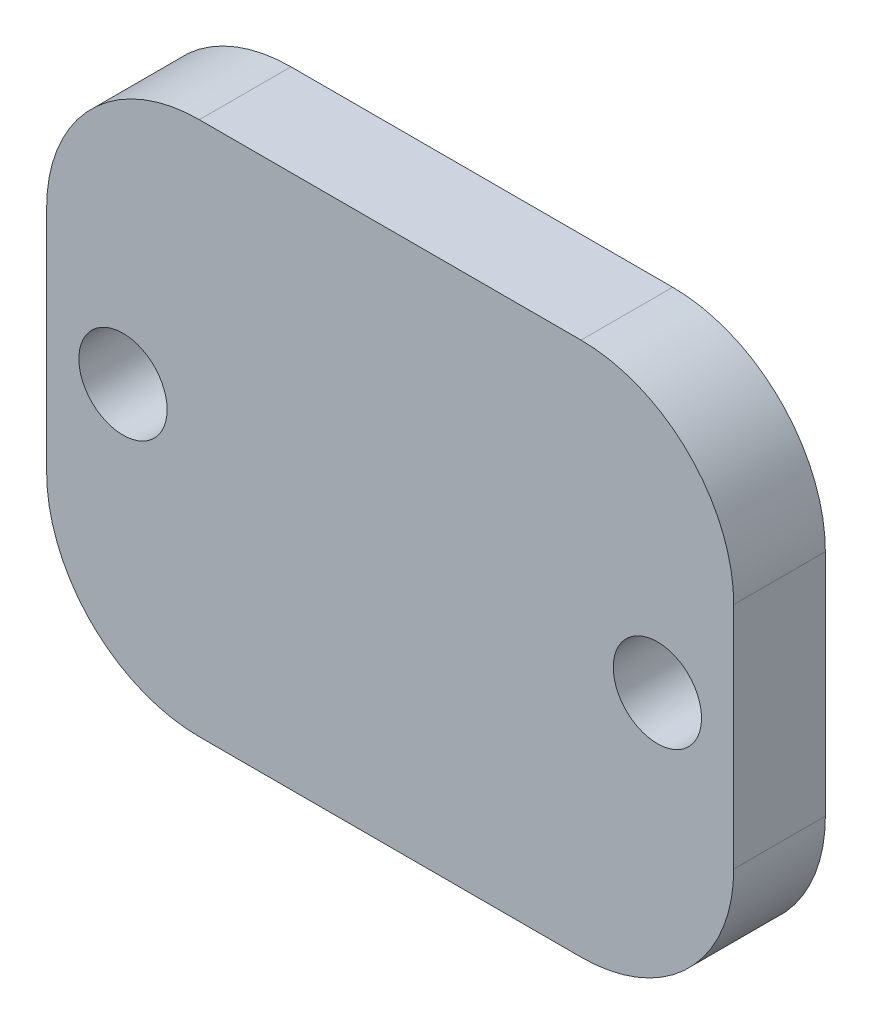
ISO-10303-21;
HEADER;
FILE_DESCRIPTION(('STEP AP214'),'2;1');
FILE_NAME('part.step','',(''),(''),'','','');
FILE_SCHEMA(('AUTOMOTIVE_DESIGN { 1 0 10303 214 1 1 1 1 }'));
ENDSEC;
DATA;
#1=APPLICATION_CONTEXT('core data for automotive mechanical design processes');
#2=APPLICATION_PROTOCOL_DEFINITION('international standard','automotive_design',2000,#1);
#3=PRODUCT_CONTEXT('',#1,'mechanical');
#4=PRODUCT('Part','Part','',(#3));
#5=PRODUCT_RELATED_PRODUCT_CATEGORY('part','',(#4));
#6=PRODUCT_DEFINITION_FORMATION('','',#4);
#7=PRODUCT_DEFINITION_CONTEXT('part definition',#1,'design');
#8=PRODUCT_DEFINITION('design','',#6,#7);
#9=PRODUCT_DEFINITION_SHAPE('','',#8);
#10=(LENGTH_UNIT() NAMED_UNIT(*) SI_UNIT(.MILLI.,.METRE.));
#11=(NAMED_UNIT(*) PLANE_ANGLE_UNIT() SI_UNIT($,.RADIAN.));
#12=(NAMED_UNIT(*) SI_UNIT($,.STERADIAN.) SOLID_ANGLE_UNIT());
#13=UNCERTAINTY_MEASURE_WITH_UNIT(LENGTH_MEASURE(1.E-05),#10,'distance_accuracy_value','');
#14=(GEOMETRIC_REPRESENTATION_CONTEXT(3) GLOBAL_UNCERTAINTY_ASSIGNED_CONTEXT((#13)) GLOBAL_UNIT_ASSIGNED_CONTEXT((#10,
#11,#12)) REPRESENTATION_CONTEXT('',''));
#15=CARTESIAN_POINT('',(0.,0.,0.));
#16=DIRECTION('',(0.,0.,1.));
#17=DIRECTION('',(1.,0.,0.));
#18=AXIS2_PLACEMENT_3D('',#15,#16,#17);
#19=CARTESIAN_POINT('',(-109.400976219246,18.7017218028714,6.));
#20=DIRECTION('',(0.,0.,-1.));
#21=DIRECTION('',(-1.,0.,0.));
#22=AXIS2_PLACEMENT_3D('',#19,#20,#21);
#23=PLANE('',#22);
#24=CARTESIAN_POINT('',(-109.400976219246,18.7017218028714,6.));
#25=DIRECTION('',(0.,0.,1.));
#26=DIRECTION('',(-1.,0.,0.));
#27=AXIS2_PLACEMENT_3D('',#24,#25,#26);
#28=CIRCLE('',#27,10.);
#29=CARTESIAN_POINT('',(-109.400976219246,8.70172180287143,6.));
#30=VERTEX_POINT('',#29);
#31=CARTESIAN_POINT('',(-99.4009762192463,18.7017218028715,6.));
#32=VERTEX_POINT('',#31);
#33=EDGE_CURVE('E170',#30,#32,#28,.T.);
#34=ORIENTED_EDGE('',*,*,#33,.T.);
#35=DIRECTION('',(0.,1.,0.));
#36=VECTOR('',#35,1.);
#37=CARTESIAN_POINT('',(-99.4009762192463,33.7017218028714,6.));
#38=LINE('',#37,#36);
#39=CARTESIAN_POINT('',(-99.4009762192463,33.7017218028714,6.));
#40=VERTEX_POINT('',#39);
#41=EDGE_CURVE('E106',#32,#40,#38,.T.);
#42=ORIENTED_EDGE('',*,*,#41,.T.);
#43=CARTESIAN_POINT('',(-109.400976219246,33.7017218028714,6.));
#44=DIRECTION('',(0.,0.,1.));
#45=DIRECTION('',(-1.,0.,0.));
#46=AXIS2_PLACEMENT_3D('',#43,#44,#45);
#47=CIRCLE('',#46,10.);
#48=CARTESIAN_POINT('',(-109.400976219246,43.7017218028714,6.));
#49=VERTEX_POINT('',#48);
#50=EDGE_CURVE('E191',#40,#49,#47,.T.);
#51=ORIENTED_EDGE('',*,*,#50,.T.);
#52=DIRECTION('',(-1.,0.,0.));
#53=VECTOR('',#52,1.);
#54=CARTESIAN_POINT('',(-134.400976219246,43.7017218028714,6.));
#55=LINE('',#54,#53);
#56=CARTESIAN_POINT('',(-134.400976219246,43.7017218028714,6.));
#57=VERTEX_POINT('',#56);
#58=EDGE_CURVE('E205',#49,#57,#55,.T.);
#59=ORIENTED_EDGE('',*,*,#58,.T.);
#60=CARTESIAN_POINT('',(-134.400976219246,33.7017218028714,6.));
#61=DIRECTION('',(0.,0.,1.));
#62=DIRECTION('',(1.,0.,0.));
#63=AXIS2_PLACEMENT_3D('',#60,#61,#62);
#64=CIRCLE('',#63,10.);
#65=CARTESIAN_POINT('',(-144.400976219246,33.7017218028714,6.));
#66=VERTEX_POINT('',#65);
#67=EDGE_CURVE('E125',#57,#66,#64,.T.);
#68=ORIENTED_EDGE('',*,*,#67,.T.);
#69=DIRECTION('',(0.,-1.,0.));
#70=VECTOR('',#69,1.);
#71=CARTESIAN_POINT('',(-144.400976219246,33.7017218028714,6.));
#72=LINE('',#71,#70);
#73=CARTESIAN_POINT('',(-144.400976219246,18.7017218028715,6.));
#74=VERTEX_POINT('',#73);
#75=EDGE_CURVE('E119',#66,#74,#72,.T.);
#76=ORIENTED_EDGE('',*,*,#75,.T.);
#77=CARTESIAN_POINT('',(-134.400976219246,18.7017218028714,6.));
#78=DIRECTION('',(0.,0.,1.));
#79=DIRECTION('',(-1.,0.,0.));
#80=AXIS2_PLACEMENT_3D('',#77,#78,#79);
#81=CIRCLE('',#80,10.);
#82=CARTESIAN_POINT('',(-134.400976219246,8.70172180287142,6.));
#83=VERTEX_POINT('',#82);
#84=EDGE_CURVE('E123',#74,#83,#81,.T.);
#85=ORIENTED_EDGE('',*,*,#84,.T.);
#86=DIRECTION('',(1.,0.,0.));
#87=VECTOR('',#86,1.);
#88=CARTESIAN_POINT('',(-134.400976219246,8.70172180287143,6.));
#89=LINE('',#88,#87);
#90=EDGE_CURVE('E63',#83,#30,#89,.T.);
#91=ORIENTED_EDGE('',*,*,#90,.T.);
#92=EDGE_LOOP('',(#34,#42,#51,#59,#68,#76,#85,#91));
#93=FACE_BOUND('',#92,.T.);
#94=CARTESIAN_POINT('',(-139.400925622596,26.2017218028714,6.));
#95=DIRECTION('',(0.,0.,1.));
#96=DIRECTION('',(1.,0.,0.));
#97=AXIS2_PLACEMENT_3D('',#94,#95,#96);
#98=CIRCLE('',#97,2.89000000000002);
#99=CARTESIAN_POINT('',(-136.510925622596,26.2017218028714,6.));
#100=VERTEX_POINT('',#99);
#101=EDGE_CURVE('E152',#100,#100,#98,.T.);
#102=ORIENTED_EDGE('',*,*,#101,.F.);
#103=EDGE_LOOP('',(#102));
#104=FACE_BOUND('',#103,.T.);
#105=CARTESIAN_POINT('',(-104.401026815897,26.2017218028714,6.));
#106=DIRECTION('',(0.,0.,1.));
#107=DIRECTION('',(-1.,0.,0.));
#108=AXIS2_PLACEMENT_3D('',#105,#106,#107);
#109=CIRCLE('',#108,2.89000000000002);
#110=CARTESIAN_POINT('',(-107.291026815897,26.2017218028714,6.));
#111=VERTEX_POINT('',#110);
#112=EDGE_CURVE('E219',#111,#111,#109,.T.);
#113=ORIENTED_EDGE('',*,*,#112,.F.);
#114=EDGE_LOOP('',(#113));
#115=FACE_BOUND('',#114,.T.);
#116=ADVANCED_FACE('F45',(#93,#104,#115),#23,.F.);
#117=CARTESIAN_POINT('',(-109.400976219246,18.7017218028714,0.));
#118=DIRECTION('',(0.,0.,-1.));
#119=DIRECTION('',(-1.,0.,0.));
#120=AXIS2_PLACEMENT_3D('',#117,#118,#119);
#121=PLANE('',#120);
#122=CARTESIAN_POINT('',(-139.400925622596,26.2017218028714,0.));
#123=DIRECTION('',(0.,0.,1.));
#124=DIRECTION('',(1.,0.,0.));
#125=AXIS2_PLACEMENT_3D('',#122,#123,#124);
#126=CIRCLE('',#125,2.89000000000002);
#127=CARTESIAN_POINT('',(-136.510925622596,26.2017218028714,0.));
#128=VERTEX_POINT('',#127);
#129=EDGE_CURVE('E215',#128,#128,#126,.T.);
#130=ORIENTED_EDGE('',*,*,#129,.T.);
#131=EDGE_LOOP('',(#130));
#132=FACE_BOUND('',#131,.T.);
#133=CARTESIAN_POINT('',(-109.400976219246,18.7017218028714,0.));
#134=DIRECTION('',(0.,0.,1.));
#135=DIRECTION('',(-1.,0.,0.));
#136=AXIS2_PLACEMENT_3D('',#133,#134,#135);
#137=CIRCLE('',#136,10.);
#138=CARTESIAN_POINT('',(-109.400976219246,8.70172180287143,0.));
#139=VERTEX_POINT('',#138);
#140=CARTESIAN_POINT('',(-99.4009762192463,18.7017218028715,0.));
#141=VERTEX_POINT('',#140);
#142=EDGE_CURVE('E147',#139,#141,#137,.T.);
#143=ORIENTED_EDGE('',*,*,#142,.F.);
#144=DIRECTION('',(1.,0.,0.));
#145=VECTOR('',#144,1.);
#146=CARTESIAN_POINT('',(-134.400976219246,8.70172180287143,0.));
#147=LINE('',#146,#145);
#148=CARTESIAN_POINT('',(-134.400976219246,8.70172180287142,0.));
#149=VERTEX_POINT('',#148);
#150=EDGE_CURVE('E98',#149,#139,#147,.T.);
#151=ORIENTED_EDGE('',*,*,#150,.F.);
#152=CARTESIAN_POINT('',(-134.400976219246,18.7017218028714,0.));
#153=DIRECTION('',(0.,0.,1.));
#154=DIRECTION('',(-1.,0.,0.));
#155=AXIS2_PLACEMENT_3D('',#152,#153,#154);
#156=CIRCLE('',#155,10.);
#157=CARTESIAN_POINT('',(-144.400976219246,18.7017218028715,0.));
#158=VERTEX_POINT('',#157);
#159=EDGE_CURVE('E92',#158,#149,#156,.T.);
#160=ORIENTED_EDGE('',*,*,#159,.F.);
#161=DIRECTION('',(0.,-1.,0.));
#162=VECTOR('',#161,1.);
#163=CARTESIAN_POINT('',(-144.400976219246,33.7017218028714,0.));
#164=LINE('',#163,#162);
#165=CARTESIAN_POINT('',(-144.400976219246,33.7017218028714,0.));
#166=VERTEX_POINT('',#165);
#167=EDGE_CURVE('E134',#166,#158,#164,.T.);
#168=ORIENTED_EDGE('',*,*,#167,.F.);
#169=CARTESIAN_POINT('',(-134.400976219246,33.7017218028714,0.));
#170=DIRECTION('',(0.,0.,1.));
#171=DIRECTION('',(1.,0.,0.));
#172=AXIS2_PLACEMENT_3D('',#169,#170,#171);
#173=CIRCLE('',#172,10.);
#174=CARTESIAN_POINT('',(-134.400976219246,43.7017218028714,0.));
#175=VERTEX_POINT('',#174);
#176=EDGE_CURVE('E161',#175,#166,#173,.T.);
#177=ORIENTED_EDGE('',*,*,#176,.F.);
#178=DIRECTION('',(-1.,0.,0.));
#179=VECTOR('',#178,1.);
#180=CARTESIAN_POINT('',(-134.400976219246,43.7017218028714,0.));
#181=LINE('',#180,#179);
#182=CARTESIAN_POINT('',(-109.400976219246,43.7017218028714,0.));
#183=VERTEX_POINT('',#182);
#184=EDGE_CURVE('E158',#183,#175,#181,.T.);
#185=ORIENTED_EDGE('',*,*,#184,.F.);
#186=CARTESIAN_POINT('',(-109.400976219246,33.7017218028714,0.));
#187=DIRECTION('',(0.,0.,1.));
#188=DIRECTION('',(-1.,0.,0.));
#189=AXIS2_PLACEMENT_3D('',#186,#187,#188);
#190=CIRCLE('',#189,10.);
#191=CARTESIAN_POINT('',(-99.4009762192463,33.7017218028714,0.));
#192=VERTEX_POINT('',#191);
#193=EDGE_CURVE('E155',#192,#183,#190,.T.);
#194=ORIENTED_EDGE('',*,*,#193,.F.);
#195=DIRECTION('',(0.,1.,0.));
#196=VECTOR('',#195,1.);
#197=CARTESIAN_POINT('',(-99.4009762192463,33.7017218028714,0.));
#198=LINE('',#197,#196);
#199=EDGE_CURVE('E151',#141,#192,#198,.T.);
#200=ORIENTED_EDGE('',*,*,#199,.F.);
#201=EDGE_LOOP('',(#143,#151,#160,#168,#177,#185,#194,#200));
#202=FACE_BOUND('',#201,.T.);
#203=CARTESIAN_POINT('',(-104.401026815897,26.2017218028714,0.));
#204=DIRECTION('',(0.,0.,1.));
#205=DIRECTION('',(-1.,0.,0.));
#206=AXIS2_PLACEMENT_3D('',#203,#204,#205);
#207=CIRCLE('',#206,2.89000000000002);
#208=CARTESIAN_POINT('',(-107.291026815897,26.2017218028714,0.));
#209=VERTEX_POINT('',#208);
#210=EDGE_CURVE('E223',#209,#209,#207,.T.);
#211=ORIENTED_EDGE('',*,*,#210,.T.);
#212=EDGE_LOOP('',(#211));
#213=FACE_BOUND('',#212,.T.);
#214=ADVANCED_FACE('F195',(#132,#202,#213),#121,.T.);
#215=CARTESIAN_POINT('',(-109.400976219246,18.7017218028714,6.));
#216=DIRECTION('',(0.,0.,-1.));
#217=DIRECTION('',(-1.,0.,0.));
#218=AXIS2_PLACEMENT_3D('',#215,#216,#217);
#219=CYLINDRICAL_SURFACE('',#218,10.);
#220=ORIENTED_EDGE('',*,*,#142,.T.);
#221=DIRECTION('',(0.,0.,-1.));
#222=VECTOR('',#221,1.);
#223=CARTESIAN_POINT('',(-99.4009762192463,18.7017218028715,6.));
#224=LINE('',#223,#222);
#225=EDGE_CURVE('E11',#32,#141,#224,.T.);
#226=ORIENTED_EDGE('',*,*,#225,.F.);
#227=ORIENTED_EDGE('',*,*,#33,.F.);
#228=DIRECTION('',(0.,0.,-1.));
#229=VECTOR('',#228,1.);
#230=CARTESIAN_POINT('',(-109.400976219246,8.70172180287143,6.));
#231=LINE('',#230,#229);
#232=EDGE_CURVE('E143',#30,#139,#231,.T.);
#233=ORIENTED_EDGE('',*,*,#232,.T.);
#234=EDGE_LOOP('',(#220,#226,#227,#233));
#235=FACE_BOUND('',#234,.T.);
#236=ADVANCED_FACE('F47',(#235),#219,.T.);
#237=CARTESIAN_POINT('',(-99.4009762192463,33.7017218028714,6.));
#238=DIRECTION('',(-1.,0.,0.));
#239=DIRECTION('',(0.,-1.,0.));
#240=AXIS2_PLACEMENT_3D('',#237,#238,#239);
#241=PLANE('',#240);
#242=ORIENTED_EDGE('',*,*,#199,.T.);
#243=DIRECTION('',(0.,0.,-1.));
#244=VECTOR('',#243,1.);
#245=CARTESIAN_POINT('',(-99.4009762192463,33.7017218028714,6.));
#246=LINE('',#245,#244);
#247=EDGE_CURVE('E55',#40,#192,#246,.T.);
#248=ORIENTED_EDGE('',*,*,#247,.F.);
#249=ORIENTED_EDGE('',*,*,#41,.F.);
#250=ORIENTED_EDGE('',*,*,#225,.T.);
#251=EDGE_LOOP('',(#242,#248,#249,#250));
#252=FACE_BOUND('',#251,.T.);
#253=ADVANCED_FACE('F257',(#252),#241,.F.);
#254=CARTESIAN_POINT('',(-109.400976219246,33.7017218028714,6.));
#255=DIRECTION('',(0.,0.,-1.));
#256=DIRECTION('',(-1.,0.,0.));
#257=AXIS2_PLACEMENT_3D('',#254,#255,#256);
#258=CYLINDRICAL_SURFACE('',#257,10.);
#259=ORIENTED_EDGE('',*,*,#193,.T.);
#260=DIRECTION('',(0.,0.,-1.));
#261=VECTOR('',#260,1.);
#262=CARTESIAN_POINT('',(-109.400976219246,43.7017218028714,6.));
#263=LINE('',#262,#261);
#264=EDGE_CURVE('E181',#49,#183,#263,.T.);
#265=ORIENTED_EDGE('',*,*,#264,.F.);
#266=ORIENTED_EDGE('',*,*,#50,.F.);
#267=ORIENTED_EDGE('',*,*,#247,.T.);
#268=EDGE_LOOP('',(#259,#265,#266,#267));
#269=FACE_BOUND('',#268,.T.);
#270=ADVANCED_FACE('F189',(#269),#258,.T.);
#271=CARTESIAN_POINT('',(-134.400976219246,43.7017218028714,6.));
#272=DIRECTION('',(0.,-1.,0.));
#273=DIRECTION('',(0.,0.,-1.));
#274=AXIS2_PLACEMENT_3D('',#271,#272,#273);
#275=PLANE('',#274);
#276=ORIENTED_EDGE('',*,*,#184,.T.);
#277=DIRECTION('',(0.,0.,-1.));
#278=VECTOR('',#277,1.);
#279=CARTESIAN_POINT('',(-134.400976219246,43.7017218028714,6.));
#280=LINE('',#279,#278);
#281=EDGE_CURVE('E177',#57,#175,#280,.T.);
#282=ORIENTED_EDGE('',*,*,#281,.F.);
#283=ORIENTED_EDGE('',*,*,#58,.F.);
#284=ORIENTED_EDGE('',*,*,#264,.T.);
#285=EDGE_LOOP('',(#276,#282,#283,#284));
#286=FACE_BOUND('',#285,.T.);
#287=ADVANCED_FACE('F200',(#286),#275,.F.);
#288=CARTESIAN_POINT('',(-134.400976219246,33.7017218028714,6.));
#289=DIRECTION('',(0.,0.,-1.));
#290=DIRECTION('',(-1.,0.,0.));
#291=AXIS2_PLACEMENT_3D('',#288,#289,#290);
#292=CYLINDRICAL_SURFACE('',#291,10.);
#293=ORIENTED_EDGE('',*,*,#176,.T.);
#294=DIRECTION('',(0.,0.,-1.));
#295=VECTOR('',#294,1.);
#296=CARTESIAN_POINT('',(-144.400976219246,33.7017218028714,6.));
#297=LINE('',#296,#295);
#298=EDGE_CURVE('E136',#66,#166,#297,.T.);
#299=ORIENTED_EDGE('',*,*,#298,.F.);
#300=ORIENTED_EDGE('',*,*,#67,.F.);
#301=ORIENTED_EDGE('',*,*,#281,.T.);
#302=EDGE_LOOP('',(#293,#299,#300,#301));
#303=FACE_BOUND('',#302,.T.);
#304=ADVANCED_FACE('F203',(#303),#292,.T.);
#305=CARTESIAN_POINT('',(-144.400976219246,33.7017218028714,6.));
#306=DIRECTION('',(1.,0.,0.));
#307=DIRECTION('',(0.,0.,-1.));
#308=AXIS2_PLACEMENT_3D('',#305,#306,#307);
#309=PLANE('',#308);
#310=ORIENTED_EDGE('',*,*,#167,.T.);
#311=DIRECTION('',(0.,0.,-1.));
#312=VECTOR('',#311,1.);
#313=CARTESIAN_POINT('',(-144.400976219246,18.7017218028715,6.));
#314=LINE('',#313,#312);
#315=EDGE_CURVE('E131',#74,#158,#314,.T.);
#316=ORIENTED_EDGE('',*,*,#315,.F.);
#317=ORIENTED_EDGE('',*,*,#75,.F.);
#318=ORIENTED_EDGE('',*,*,#298,.T.);
#319=EDGE_LOOP('',(#310,#316,#317,#318));
#320=FACE_BOUND('',#319,.T.);
#321=ADVANCED_FACE('F132',(#320),#309,.F.);
#322=CARTESIAN_POINT('',(-134.400976219246,18.7017218028714,6.));
#323=DIRECTION('',(0.,0.,-1.));
#324=DIRECTION('',(-1.,0.,0.));
#325=AXIS2_PLACEMENT_3D('',#322,#323,#324);
#326=CYLINDRICAL_SURFACE('',#325,10.);
#327=ORIENTED_EDGE('',*,*,#159,.T.);
#328=DIRECTION('',(0.,0.,-1.));
#329=VECTOR('',#328,1.);
#330=CARTESIAN_POINT('',(-134.400976219246,8.70172180287142,6.));
#331=LINE('',#330,#329);
#332=EDGE_CURVE('E137',#83,#149,#331,.T.);
#333=ORIENTED_EDGE('',*,*,#332,.F.);
#334=ORIENTED_EDGE('',*,*,#84,.F.);
#335=ORIENTED_EDGE('',*,*,#315,.T.);
#336=EDGE_LOOP('',(#327,#333,#334,#335));
#337=FACE_BOUND('',#336,.T.);
#338=ADVANCED_FACE('F139',(#337),#326,.T.);
#339=CARTESIAN_POINT('',(-134.400976219246,8.70172180287143,6.));
#340=DIRECTION('',(0.,1.,0.));
#341=DIRECTION('',(0.,0.,1.));
#342=AXIS2_PLACEMENT_3D('',#339,#340,#341);
#343=PLANE('',#342);
#344=ORIENTED_EDGE('',*,*,#150,.T.);
#345=ORIENTED_EDGE('',*,*,#232,.F.);
#346=ORIENTED_EDGE('',*,*,#90,.F.);
#347=ORIENTED_EDGE('',*,*,#332,.T.);
#348=EDGE_LOOP('',(#344,#345,#346,#347));
#349=FACE_BOUND('',#348,.T.);
#350=ADVANCED_FACE('F245',(#349),#343,.F.);
#351=CARTESIAN_POINT('',(-139.400925622596,26.2017218028714,6.));
#352=DIRECTION('',(0.,0.,-1.));
#353=DIRECTION('',(-1.,0.,0.));
#354=AXIS2_PLACEMENT_3D('',#351,#352,#353);
#355=CYLINDRICAL_SURFACE('',#354,2.89000000000002);
#356=ORIENTED_EDGE('',*,*,#101,.T.);
#357=EDGE_LOOP('',(#356));
#358=FACE_BOUND('',#357,.T.);
#359=ORIENTED_EDGE('',*,*,#129,.F.);
#360=EDGE_LOOP('',(#359));
#361=FACE_BOUND('',#360,.T.);
#362=ADVANCED_FACE('F242',(#358,#361),#355,.F.);
#363=CARTESIAN_POINT('',(-104.401026815897,26.2017218028714,6.));
#364=DIRECTION('',(0.,0.,-1.));
#365=DIRECTION('',(-1.,0.,0.));
#366=AXIS2_PLACEMENT_3D('',#363,#364,#365);
#367=CYLINDRICAL_SURFACE('',#366,2.89000000000002);
#368=ORIENTED_EDGE('',*,*,#112,.T.);
#369=EDGE_LOOP('',(#368));
#370=FACE_BOUND('',#369,.T.);
#371=ORIENTED_EDGE('',*,*,#210,.F.);
#372=EDGE_LOOP('',(#371));
#373=FACE_BOUND('',#372,.T.);
#374=ADVANCED_FACE('F231',(#370,#373),#367,.F.);
#375=CLOSED_SHELL('',(#116,#214,#236,#253,#270,#287,#304,#321,#338,#350,#362,#374));
#376=MANIFOLD_SOLID_BREP('B2',#375);
#377=ADVANCED_BREP_SHAPE_REPRESENTATION('',(#18,#376),#14);
#378=SHAPE_DEFINITION_REPRESENTATION(#9,#377);
ENDSEC;
END-ISO-10303-21;
